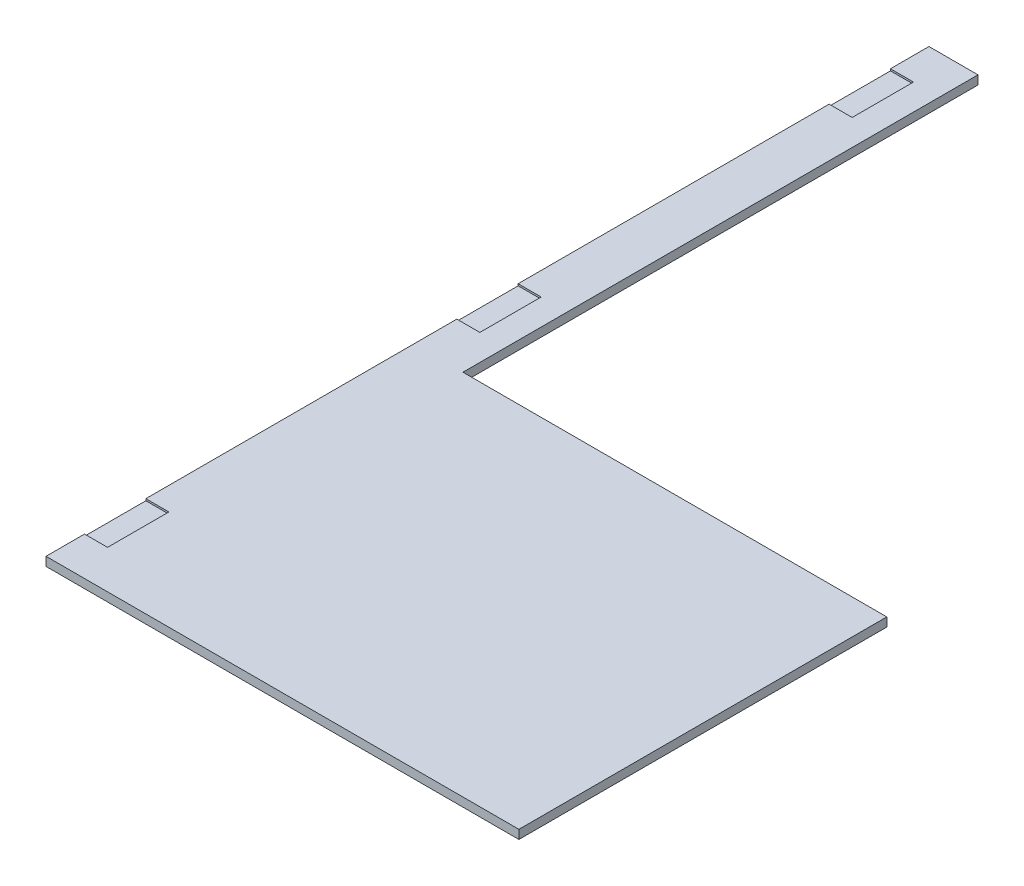
ISO-10303-21;
HEADER;
FILE_DESCRIPTION(('STEP AP214'),'2;1');
FILE_NAME('part.step','',(''),(''),'','','');
FILE_SCHEMA(('AUTOMOTIVE_DESIGN { 1 0 10303 214 1 1 1 1 }'));
ENDSEC;
DATA;
#1=APPLICATION_CONTEXT('core data for automotive mechanical design processes');
#2=APPLICATION_PROTOCOL_DEFINITION('international standard','automotive_design',2000,#1);
#3=PRODUCT_CONTEXT('',#1,'mechanical');
#4=PRODUCT('Part','Part','',(#3));
#5=PRODUCT_RELATED_PRODUCT_CATEGORY('part','',(#4));
#6=PRODUCT_DEFINITION_FORMATION('','',#4);
#7=PRODUCT_DEFINITION_CONTEXT('part definition',#1,'design');
#8=PRODUCT_DEFINITION('design','',#6,#7);
#9=PRODUCT_DEFINITION_SHAPE('','',#8);
#10=(LENGTH_UNIT() NAMED_UNIT(*) SI_UNIT(.MILLI.,.METRE.));
#11=(NAMED_UNIT(*) PLANE_ANGLE_UNIT() SI_UNIT($,.RADIAN.));
#12=(NAMED_UNIT(*) SI_UNIT($,.STERADIAN.) SOLID_ANGLE_UNIT());
#13=UNCERTAINTY_MEASURE_WITH_UNIT(LENGTH_MEASURE(1.E-05),#10,'distance_accuracy_value','');
#14=(GEOMETRIC_REPRESENTATION_CONTEXT(3) GLOBAL_UNCERTAINTY_ASSIGNED_CONTEXT((#13)) GLOBAL_UNIT_ASSIGNED_CONTEXT((#10,
#11,#12)) REPRESENTATION_CONTEXT('',''));
#15=CARTESIAN_POINT('',(0.,0.,0.));
#16=DIRECTION('',(0.,0.,1.));
#17=DIRECTION('',(1.,0.,0.));
#18=AXIS2_PLACEMENT_3D('',#15,#16,#17);
#19=CARTESIAN_POINT('',(489.74375,18.25625,-381.));
#20=DIRECTION('',(0.,0.,1.));
#21=DIRECTION('',(1.,0.,0.));
#22=AXIS2_PLACEMENT_3D('',#19,#20,#21);
#23=PLANE('',#22);
#24=DIRECTION('',(-1.,0.,0.));
#25=VECTOR('',#24,1.);
#26=CARTESIAN_POINT('',(489.74375,0.,-381.));
#27=LINE('',#26,#25);
#28=CARTESIAN_POINT('',(489.74375,0.,-381.));
#29=VERTEX_POINT('',#28);
#30=CARTESIAN_POINT('',(-388.14375,0.,-381.));
#31=VERTEX_POINT('',#30);
#32=EDGE_CURVE('E302',#29,#31,#27,.T.);
#33=ORIENTED_EDGE('',*,*,#32,.T.);
#34=DIRECTION('',(0.,-1.,0.));
#35=VECTOR('',#34,1.);
#36=CARTESIAN_POINT('',(-388.14375,18.25625,-381.));
#37=LINE('',#36,#35);
#38=CARTESIAN_POINT('',(-388.14375,18.25625,-381.));
#39=VERTEX_POINT('',#38);
#40=EDGE_CURVE('E11',#39,#31,#37,.T.);
#41=ORIENTED_EDGE('',*,*,#40,.F.);
#42=DIRECTION('',(-1.,0.,0.));
#43=VECTOR('',#42,1.);
#44=CARTESIAN_POINT('',(489.74375,18.25625,-381.));
#45=LINE('',#44,#43);
#46=CARTESIAN_POINT('',(489.74375,18.25625,-381.));
#47=VERTEX_POINT('',#46);
#48=EDGE_CURVE('E279',#47,#39,#45,.T.);
#49=ORIENTED_EDGE('',*,*,#48,.F.);
#50=DIRECTION('',(0.,-1.,0.));
#51=VECTOR('',#50,1.);
#52=CARTESIAN_POINT('',(489.74375,18.25625,-381.));
#53=LINE('',#52,#51);
#54=EDGE_CURVE('E301',#47,#29,#53,.T.);
#55=ORIENTED_EDGE('',*,*,#54,.T.);
#56=EDGE_LOOP('',(#33,#41,#49,#55));
#57=FACE_BOUND('',#56,.T.);
#58=ADVANCED_FACE('F38',(#57),#23,.F.);
#59=CARTESIAN_POINT('',(-388.14375,18.25625,-1447.8));
#60=DIRECTION('',(-1.,0.,0.));
#61=DIRECTION('',(0.,0.,1.));
#62=AXIS2_PLACEMENT_3D('',#59,#60,#61);
#63=PLANE('',#62);
#64=DIRECTION('',(0.,0.,-1.));
#65=VECTOR('',#64,1.);
#66=CARTESIAN_POINT('',(-388.14375,0.,-1447.8));
#67=LINE('',#66,#65);
#68=CARTESIAN_POINT('',(-388.14375,0.,-1447.8));
#69=VERTEX_POINT('',#68);
#70=EDGE_CURVE('E306',#31,#69,#67,.T.);
#71=ORIENTED_EDGE('',*,*,#70,.T.);
#72=DIRECTION('',(0.,-1.,0.));
#73=VECTOR('',#72,1.);
#74=CARTESIAN_POINT('',(-388.14375,18.25625,-1447.8));
#75=LINE('',#74,#73);
#76=CARTESIAN_POINT('',(-388.14375,18.25625,-1447.8));
#77=VERTEX_POINT('',#76);
#78=EDGE_CURVE('E46',#77,#69,#75,.T.);
#79=ORIENTED_EDGE('',*,*,#78,.F.);
#80=DIRECTION('',(0.,0.,-1.));
#81=VECTOR('',#80,1.);
#82=CARTESIAN_POINT('',(-388.14375,18.25625,-1447.8));
#83=LINE('',#82,#81);
#84=EDGE_CURVE('E283',#39,#77,#83,.T.);
#85=ORIENTED_EDGE('',*,*,#84,.F.);
#86=ORIENTED_EDGE('',*,*,#40,.T.);
#87=EDGE_LOOP('',(#71,#79,#85,#86));
#88=FACE_BOUND('',#87,.T.);
#89=ADVANCED_FACE('F391',(#88),#63,.F.);
#90=CARTESIAN_POINT('',(-489.74375,18.25625,-1447.8));
#91=DIRECTION('',(0.,0.,1.));
#92=DIRECTION('',(1.,0.,0.));
#93=AXIS2_PLACEMENT_3D('',#90,#91,#92);
#94=PLANE('',#93);
#95=DIRECTION('',(-1.,0.,0.));
#96=VECTOR('',#95,1.);
#97=CARTESIAN_POINT('',(-489.74375,0.,-1447.8));
#98=LINE('',#97,#96);
#99=CARTESIAN_POINT('',(-489.74375,0.,-1447.8));
#100=VERTEX_POINT('',#99);
#101=EDGE_CURVE('E310',#69,#100,#98,.T.);
#102=ORIENTED_EDGE('',*,*,#101,.T.);
#103=DIRECTION('',(0.,-1.,0.));
#104=VECTOR('',#103,1.);
#105=CARTESIAN_POINT('',(-489.74375,18.25625,-1447.8));
#106=LINE('',#105,#104);
#107=CARTESIAN_POINT('',(-489.74375,18.25625,-1447.8));
#108=VERTEX_POINT('',#107);
#109=EDGE_CURVE('E333',#108,#100,#106,.T.);
#110=ORIENTED_EDGE('',*,*,#109,.F.);
#111=DIRECTION('',(-1.,0.,0.));
#112=VECTOR('',#111,1.);
#113=CARTESIAN_POINT('',(-489.74375,18.25625,-1447.8));
#114=LINE('',#113,#112);
#115=EDGE_CURVE('E287',#77,#108,#114,.T.);
#116=ORIENTED_EDGE('',*,*,#115,.F.);
#117=ORIENTED_EDGE('',*,*,#78,.T.);
#118=EDGE_LOOP('',(#102,#110,#116,#117));
#119=FACE_BOUND('',#118,.T.);
#120=ADVANCED_FACE('F342',(#119),#94,.F.);
#121=CARTESIAN_POINT('',(-489.74375,18.25625,381.));
#122=DIRECTION('',(1.,0.,0.));
#123=DIRECTION('',(0.,0.,-1.));
#124=AXIS2_PLACEMENT_3D('',#121,#122,#123);
#125=PLANE('',#124);
#126=DIRECTION('',(0.,0.,1.));
#127=VECTOR('',#126,1.);
#128=CARTESIAN_POINT('',(-489.74375,14.44625,-1368.02719145695));
#129=LINE('',#128,#127);
#130=CARTESIAN_POINT('',(-489.74375,14.44625,-1368.02719145695));
#131=VERTEX_POINT('',#130);
#132=CARTESIAN_POINT('',(-489.74375,14.44625,-1241.02719145695));
#133=VERTEX_POINT('',#132);
#134=EDGE_CURVE('E177',#131,#133,#129,.T.);
#135=ORIENTED_EDGE('',*,*,#134,.F.);
#136=DIRECTION('',(0.,1.,0.));
#137=VECTOR('',#136,1.);
#138=CARTESIAN_POINT('',(-489.74375,14.44625,-1368.02719145695));
#139=LINE('',#138,#137);
#140=CARTESIAN_POINT('',(-489.74375,18.25625,-1368.02719145695));
#141=VERTEX_POINT('',#140);
#142=EDGE_CURVE('E307',#131,#141,#139,.T.);
#143=ORIENTED_EDGE('',*,*,#142,.T.);
#144=DIRECTION('',(0.,0.,1.));
#145=VECTOR('',#144,1.);
#146=CARTESIAN_POINT('',(-489.74375,18.25625,-381.));
#147=LINE('',#146,#145);
#148=EDGE_CURVE('E291',#108,#141,#147,.T.);
#149=ORIENTED_EDGE('',*,*,#148,.F.);
#150=ORIENTED_EDGE('',*,*,#109,.T.);
#151=DIRECTION('',(0.,0.,1.));
#152=VECTOR('',#151,1.);
#153=CARTESIAN_POINT('',(-489.74375,0.,381.));
#154=LINE('',#153,#152);
#155=CARTESIAN_POINT('',(-489.74375,0.,381.));
#156=VERTEX_POINT('',#155);
#157=EDGE_CURVE('E314',#100,#156,#154,.T.);
#158=ORIENTED_EDGE('',*,*,#157,.T.);
#159=DIRECTION('',(0.,-1.,0.));
#160=VECTOR('',#159,1.);
#161=CARTESIAN_POINT('',(-489.74375,18.25625,381.));
#162=LINE('',#161,#160);
#163=CARTESIAN_POINT('',(-489.74375,18.25625,381.));
#164=VERTEX_POINT('',#163);
#165=EDGE_CURVE('E329',#164,#156,#162,.T.);
#166=ORIENTED_EDGE('',*,*,#165,.F.);
#167=CARTESIAN_POINT('',(-489.74375,18.25625,301.227191456949));
#168=VERTEX_POINT('',#167);
#169=EDGE_CURVE('E290',#168,#164,#147,.T.);
#170=ORIENTED_EDGE('',*,*,#169,.F.);
#171=DIRECTION('',(0.,1.,0.));
#172=VECTOR('',#171,1.);
#173=CARTESIAN_POINT('',(-489.743750000016,14.44625,301.227191456949));
#174=LINE('',#173,#172);
#175=CARTESIAN_POINT('',(-489.743750000016,14.44625,301.227191456949));
#176=VERTEX_POINT('',#175);
#177=EDGE_CURVE('E53',#176,#168,#174,.T.);
#178=ORIENTED_EDGE('',*,*,#177,.F.);
#179=DIRECTION('',(0.,0.,1.));
#180=VECTOR('',#179,1.);
#181=CARTESIAN_POINT('',(-489.743750000016,14.44625,174.227191456949));
#182=LINE('',#181,#180);
#183=CARTESIAN_POINT('',(-489.743750000016,14.44625,174.227191456949));
#184=VERTEX_POINT('',#183);
#185=EDGE_CURVE('E246',#184,#176,#182,.T.);
#186=ORIENTED_EDGE('',*,*,#185,.F.);
#187=DIRECTION('',(0.,1.,0.));
#188=VECTOR('',#187,1.);
#189=CARTESIAN_POINT('',(-489.743750000016,14.44625,174.227191456949));
#190=LINE('',#189,#188);
#191=CARTESIAN_POINT('',(-489.743750000016,18.25625,174.227191456949));
#192=VERTEX_POINT('',#191);
#193=EDGE_CURVE('E259',#184,#192,#190,.T.);
#194=ORIENTED_EDGE('',*,*,#193,.T.);
#195=CARTESIAN_POINT('',(-489.74375,18.25625,-469.9));
#196=VERTEX_POINT('',#195);
#197=EDGE_CURVE('E364',#196,#192,#147,.T.);
#198=ORIENTED_EDGE('',*,*,#197,.F.);
#199=DIRECTION('',(0.,1.,0.));
#200=VECTOR('',#199,1.);
#201=CARTESIAN_POINT('',(-489.743749999992,14.44625,-469.9));
#202=LINE('',#201,#200);
#203=CARTESIAN_POINT('',(-489.743749999992,14.44625,-469.9));
#204=VERTEX_POINT('',#203);
#205=EDGE_CURVE('E61',#204,#196,#202,.T.);
#206=ORIENTED_EDGE('',*,*,#205,.F.);
#207=DIRECTION('',(0.,0.,1.));
#208=VECTOR('',#207,1.);
#209=CARTESIAN_POINT('',(-489.743749999992,14.44625,-596.9));
#210=LINE('',#209,#208);
#211=CARTESIAN_POINT('',(-489.743749999992,14.44625,-596.9));
#212=VERTEX_POINT('',#211);
#213=EDGE_CURVE('E207',#212,#204,#210,.T.);
#214=ORIENTED_EDGE('',*,*,#213,.F.);
#215=DIRECTION('',(0.,1.,0.));
#216=VECTOR('',#215,1.);
#217=CARTESIAN_POINT('',(-489.743749999992,14.44625,-596.9));
#218=LINE('',#217,#216);
#219=CARTESIAN_POINT('',(-489.743749999992,18.25625,-596.9));
#220=VERTEX_POINT('',#219);
#221=EDGE_CURVE('E220',#212,#220,#218,.T.);
#222=ORIENTED_EDGE('',*,*,#221,.T.);
#223=CARTESIAN_POINT('',(-489.74375,18.25625,-1241.02719145695));
#224=VERTEX_POINT('',#223);
#225=EDGE_CURVE('E193',#224,#220,#147,.T.);
#226=ORIENTED_EDGE('',*,*,#225,.F.);
#227=DIRECTION('',(0.,1.,0.));
#228=VECTOR('',#227,1.);
#229=CARTESIAN_POINT('',(-489.74375,14.44625,-1241.02719145695));
#230=LINE('',#229,#228);
#231=EDGE_CURVE('E169',#133,#224,#230,.T.);
#232=ORIENTED_EDGE('',*,*,#231,.F.);
#233=EDGE_LOOP('',(#135,#143,#149,#150,#158,#166,#170,#178,#186,#194,#198,#206,#214,#222,#226,#232));
#234=FACE_BOUND('',#233,.T.);
#235=ADVANCED_FACE('F190',(#234),#125,.F.);
#236=CARTESIAN_POINT('',(-489.74375,18.25625,381.));
#237=DIRECTION('',(0.,0.,-1.));
#238=DIRECTION('',(-1.,0.,0.));
#239=AXIS2_PLACEMENT_3D('',#236,#237,#238);
#240=PLANE('',#239);
#241=DIRECTION('',(1.,0.,0.));
#242=VECTOR('',#241,1.);
#243=CARTESIAN_POINT('',(-489.74375,0.,381.));
#244=LINE('',#243,#242);
#245=CARTESIAN_POINT('',(489.74375,0.,381.));
#246=VERTEX_POINT('',#245);
#247=EDGE_CURVE('E317',#156,#246,#244,.T.);
#248=ORIENTED_EDGE('',*,*,#247,.T.);
#249=DIRECTION('',(0.,-1.,0.));
#250=VECTOR('',#249,1.);
#251=CARTESIAN_POINT('',(489.74375,18.25625,381.));
#252=LINE('',#251,#250);
#253=CARTESIAN_POINT('',(489.74375,18.25625,381.));
#254=VERTEX_POINT('',#253);
#255=EDGE_CURVE('E325',#254,#246,#252,.T.);
#256=ORIENTED_EDGE('',*,*,#255,.F.);
#257=DIRECTION('',(1.,0.,0.));
#258=VECTOR('',#257,1.);
#259=CARTESIAN_POINT('',(-489.74375,18.25625,381.));
#260=LINE('',#259,#258);
#261=EDGE_CURVE('E295',#164,#254,#260,.T.);
#262=ORIENTED_EDGE('',*,*,#261,.F.);
#263=ORIENTED_EDGE('',*,*,#165,.T.);
#264=EDGE_LOOP('',(#248,#256,#262,#263));
#265=FACE_BOUND('',#264,.T.);
#266=ADVANCED_FACE('F355',(#265),#240,.F.);
#267=CARTESIAN_POINT('',(489.74375,18.25625,381.));
#268=DIRECTION('',(-1.,0.,0.));
#269=DIRECTION('',(0.,0.,1.));
#270=AXIS2_PLACEMENT_3D('',#267,#268,#269);
#271=PLANE('',#270);
#272=DIRECTION('',(0.,0.,-1.));
#273=VECTOR('',#272,1.);
#274=CARTESIAN_POINT('',(489.74375,0.,381.));
#275=LINE('',#274,#273);
#276=EDGE_CURVE('E284',#246,#29,#275,.T.);
#277=ORIENTED_EDGE('',*,*,#276,.T.);
#278=ORIENTED_EDGE('',*,*,#54,.F.);
#279=DIRECTION('',(0.,0.,-1.));
#280=VECTOR('',#279,1.);
#281=CARTESIAN_POINT('',(489.74375,18.25625,381.));
#282=LINE('',#281,#280);
#283=EDGE_CURVE('E298',#254,#47,#282,.T.);
#284=ORIENTED_EDGE('',*,*,#283,.F.);
#285=ORIENTED_EDGE('',*,*,#255,.T.);
#286=EDGE_LOOP('',(#277,#278,#284,#285));
#287=FACE_BOUND('',#286,.T.);
#288=ADVANCED_FACE('F394',(#287),#271,.F.);
#289=CARTESIAN_POINT('',(0.,18.25625,0.));
#290=DIRECTION('',(0.,1.,0.));
#291=DIRECTION('',(0.,0.,1.));
#292=AXIS2_PLACEMENT_3D('',#289,#290,#291);
#293=PLANE('',#292);
#294=DIRECTION('',(-1.,0.,0.));
#295=VECTOR('',#294,1.);
#296=CARTESIAN_POINT('',(-489.74375,18.25625,-1368.02719145695));
#297=LINE('',#296,#295);
#298=CARTESIAN_POINT('',(-441.99175,18.25625,-1368.02719145695));
#299=VERTEX_POINT('',#298);
#300=EDGE_CURVE('E187',#299,#141,#297,.T.);
#301=ORIENTED_EDGE('',*,*,#300,.F.);
#302=DIRECTION('',(0.,0.,-1.));
#303=VECTOR('',#302,1.);
#304=CARTESIAN_POINT('',(-441.99175,18.25625,-1368.02719145695));
#305=LINE('',#304,#303);
#306=CARTESIAN_POINT('',(-441.99175,18.25625,-1241.02719145695));
#307=VERTEX_POINT('',#306);
#308=EDGE_CURVE('E374',#307,#299,#305,.T.);
#309=ORIENTED_EDGE('',*,*,#308,.F.);
#310=DIRECTION('',(1.,0.,0.));
#311=VECTOR('',#310,1.);
#312=CARTESIAN_POINT('',(-441.99175,18.25625,-1241.02719145695));
#313=LINE('',#312,#311);
#314=EDGE_CURVE('E234',#224,#307,#313,.T.);
#315=ORIENTED_EDGE('',*,*,#314,.F.);
#316=ORIENTED_EDGE('',*,*,#225,.T.);
#317=DIRECTION('',(-1.,0.,0.));
#318=VECTOR('',#317,1.);
#319=CARTESIAN_POINT('',(-489.743749999992,18.25625,-596.9));
#320=LINE('',#319,#318);
#321=CARTESIAN_POINT('',(-441.991749999992,18.25625,-596.9));
#322=VERTEX_POINT('',#321);
#323=EDGE_CURVE('E221',#322,#220,#320,.T.);
#324=ORIENTED_EDGE('',*,*,#323,.F.);
#325=DIRECTION('',(0.,0.,-1.));
#326=VECTOR('',#325,1.);
#327=CARTESIAN_POINT('',(-441.991749999992,18.25625,-596.9));
#328=LINE('',#327,#326);
#329=CARTESIAN_POINT('',(-441.991749999992,18.25625,-469.9));
#330=VERTEX_POINT('',#329);
#331=EDGE_CURVE('E208',#330,#322,#328,.T.);
#332=ORIENTED_EDGE('',*,*,#331,.F.);
#333=DIRECTION('',(1.,0.,0.));
#334=VECTOR('',#333,1.);
#335=CARTESIAN_POINT('',(-441.991749999992,18.25625,-469.9));
#336=LINE('',#335,#334);
#337=EDGE_CURVE('E224',#196,#330,#336,.T.);
#338=ORIENTED_EDGE('',*,*,#337,.F.);
#339=ORIENTED_EDGE('',*,*,#197,.T.);
#340=DIRECTION('',(-1.,0.,0.));
#341=VECTOR('',#340,1.);
#342=CARTESIAN_POINT('',(-489.743750000016,18.25625,174.227191456949));
#343=LINE('',#342,#341);
#344=CARTESIAN_POINT('',(-441.991749999984,18.25625,174.227191456949));
#345=VERTEX_POINT('',#344);
#346=EDGE_CURVE('E260',#345,#192,#343,.T.);
#347=ORIENTED_EDGE('',*,*,#346,.F.);
#348=DIRECTION('',(0.,0.,-1.));
#349=VECTOR('',#348,1.);
#350=CARTESIAN_POINT('',(-441.991749999984,18.25625,174.227191456949));
#351=LINE('',#350,#349);
#352=CARTESIAN_POINT('',(-441.991749999984,18.25625,301.227191456949));
#353=VERTEX_POINT('',#352);
#354=EDGE_CURVE('E247',#353,#345,#351,.T.);
#355=ORIENTED_EDGE('',*,*,#354,.F.);
#356=DIRECTION('',(1.,0.,0.));
#357=VECTOR('',#356,1.);
#358=CARTESIAN_POINT('',(-441.991749999984,18.25625,301.227191456949));
#359=LINE('',#358,#357);
#360=EDGE_CURVE('E263',#168,#353,#359,.T.);
#361=ORIENTED_EDGE('',*,*,#360,.F.);
#362=ORIENTED_EDGE('',*,*,#169,.T.);
#363=ORIENTED_EDGE('',*,*,#261,.T.);
#364=ORIENTED_EDGE('',*,*,#283,.T.);
#365=ORIENTED_EDGE('',*,*,#48,.T.);
#366=ORIENTED_EDGE('',*,*,#84,.T.);
#367=ORIENTED_EDGE('',*,*,#115,.T.);
#368=ORIENTED_EDGE('',*,*,#148,.T.);
#369=EDGE_LOOP('',(#301,#309,#315,#316,#324,#332,#338,#339,#347,#355,#361,#362,#363,#364,#365,
#366,#367,#368));
#370=FACE_BOUND('',#369,.T.);
#371=ADVANCED_FACE('F360',(#370),#293,.T.);
#372=CARTESIAN_POINT('',(0.,0.,0.));
#373=DIRECTION('',(0.,1.,0.));
#374=DIRECTION('',(0.,0.,1.));
#375=AXIS2_PLACEMENT_3D('',#372,#373,#374);
#376=PLANE('',#375);
#377=ORIENTED_EDGE('',*,*,#32,.F.);
#378=ORIENTED_EDGE('',*,*,#276,.F.);
#379=ORIENTED_EDGE('',*,*,#247,.F.);
#380=ORIENTED_EDGE('',*,*,#157,.F.);
#381=ORIENTED_EDGE('',*,*,#101,.F.);
#382=ORIENTED_EDGE('',*,*,#70,.F.);
#383=EDGE_LOOP('',(#377,#378,#379,#380,#381,#382));
#384=FACE_BOUND('',#383,.T.);
#385=ADVANCED_FACE('F347',(#384),#376,.F.);
#386=CARTESIAN_POINT('',(-489.743750000016,14.44625,174.227191456949));
#387=DIRECTION('',(0.,0.,-1.));
#388=DIRECTION('',(-1.,0.,0.));
#389=AXIS2_PLACEMENT_3D('',#386,#387,#388);
#390=PLANE('',#389);
#391=ORIENTED_EDGE('',*,*,#346,.T.);
#392=ORIENTED_EDGE('',*,*,#193,.F.);
#393=DIRECTION('',(-1.,0.,0.));
#394=VECTOR('',#393,1.);
#395=CARTESIAN_POINT('',(-489.743750000016,14.44625,174.227191456949));
#396=LINE('',#395,#394);
#397=CARTESIAN_POINT('',(-441.991749999984,14.44625,174.227191456949));
#398=VERTEX_POINT('',#397);
#399=EDGE_CURVE('E242',#398,#184,#396,.T.);
#400=ORIENTED_EDGE('',*,*,#399,.F.);
#401=DIRECTION('',(0.,1.,0.));
#402=VECTOR('',#401,1.);
#403=CARTESIAN_POINT('',(-441.991749999984,14.44625,174.227191456949));
#404=LINE('',#403,#402);
#405=EDGE_CURVE('E225',#398,#345,#404,.T.);
#406=ORIENTED_EDGE('',*,*,#405,.T.);
#407=EDGE_LOOP('',(#391,#392,#400,#406));
#408=FACE_BOUND('',#407,.T.);
#409=ADVANCED_FACE('F427',(#408),#390,.F.);
#410=CARTESIAN_POINT('',(-441.991749999984,14.44625,174.227191456949));
#411=DIRECTION('',(1.,0.,0.));
#412=DIRECTION('',(0.,0.,-1.));
#413=AXIS2_PLACEMENT_3D('',#410,#411,#412);
#414=PLANE('',#413);
#415=ORIENTED_EDGE('',*,*,#354,.T.);
#416=ORIENTED_EDGE('',*,*,#405,.F.);
#417=DIRECTION('',(0.,0.,-1.));
#418=VECTOR('',#417,1.);
#419=CARTESIAN_POINT('',(-441.991749999984,14.44625,174.227191456949));
#420=LINE('',#419,#418);
#421=CARTESIAN_POINT('',(-441.991749999984,14.44625,301.227191456949));
#422=VERTEX_POINT('',#421);
#423=EDGE_CURVE('E255',#422,#398,#420,.T.);
#424=ORIENTED_EDGE('',*,*,#423,.F.);
#425=DIRECTION('',(0.,1.,0.));
#426=VECTOR('',#425,1.);
#427=CARTESIAN_POINT('',(-441.991749999984,14.44625,301.227191456949));
#428=LINE('',#427,#426);
#429=EDGE_CURVE('E271',#422,#353,#428,.T.);
#430=ORIENTED_EDGE('',*,*,#429,.T.);
#431=EDGE_LOOP('',(#415,#416,#424,#430));
#432=FACE_BOUND('',#431,.T.);
#433=ADVANCED_FACE('F432',(#432),#414,.F.);
#434=CARTESIAN_POINT('',(-441.991749999984,14.44625,301.227191456949));
#435=DIRECTION('',(0.,0.,1.));
#436=DIRECTION('',(1.,0.,0.));
#437=AXIS2_PLACEMENT_3D('',#434,#435,#436);
#438=PLANE('',#437);
#439=ORIENTED_EDGE('',*,*,#360,.T.);
#440=ORIENTED_EDGE('',*,*,#429,.F.);
#441=DIRECTION('',(1.,0.,0.));
#442=VECTOR('',#441,1.);
#443=CARTESIAN_POINT('',(-441.991749999984,14.44625,301.227191456949));
#444=LINE('',#443,#442);
#445=EDGE_CURVE('E251',#176,#422,#444,.T.);
#446=ORIENTED_EDGE('',*,*,#445,.F.);
#447=ORIENTED_EDGE('',*,*,#177,.T.);
#448=EDGE_LOOP('',(#439,#440,#446,#447));
#449=FACE_BOUND('',#448,.T.);
#450=ADVANCED_FACE('F442',(#449),#438,.F.);
#451=CARTESIAN_POINT('',(0.,14.44625,0.));
#452=DIRECTION('',(0.,-1.,0.));
#453=DIRECTION('',(0.,0.,-1.));
#454=AXIS2_PLACEMENT_3D('',#451,#452,#453);
#455=PLANE('',#454);
#456=ORIENTED_EDGE('',*,*,#399,.T.);
#457=ORIENTED_EDGE('',*,*,#185,.T.);
#458=ORIENTED_EDGE('',*,*,#445,.T.);
#459=ORIENTED_EDGE('',*,*,#423,.T.);
#460=EDGE_LOOP('',(#456,#457,#458,#459));
#461=FACE_BOUND('',#460,.T.);
#462=ADVANCED_FACE('F452',(#461),#455,.F.);
#463=CARTESIAN_POINT('',(-489.743749999992,14.44625,-596.9));
#464=DIRECTION('',(0.,0.,-1.));
#465=DIRECTION('',(-1.,0.,0.));
#466=AXIS2_PLACEMENT_3D('',#463,#464,#465);
#467=PLANE('',#466);
#468=ORIENTED_EDGE('',*,*,#323,.T.);
#469=ORIENTED_EDGE('',*,*,#221,.F.);
#470=DIRECTION('',(-1.,0.,0.));
#471=VECTOR('',#470,1.);
#472=CARTESIAN_POINT('',(-489.743749999992,14.44625,-596.9));
#473=LINE('',#472,#471);
#474=CARTESIAN_POINT('',(-441.991749999992,14.44625,-596.9));
#475=VERTEX_POINT('',#474);
#476=EDGE_CURVE('E203',#475,#212,#473,.T.);
#477=ORIENTED_EDGE('',*,*,#476,.F.);
#478=DIRECTION('',(0.,1.,0.));
#479=VECTOR('',#478,1.);
#480=CARTESIAN_POINT('',(-441.991749999992,14.44625,-596.9));
#481=LINE('',#480,#479);
#482=EDGE_CURVE('E231',#475,#322,#481,.T.);
#483=ORIENTED_EDGE('',*,*,#482,.T.);
#484=EDGE_LOOP('',(#468,#469,#477,#483));
#485=FACE_BOUND('',#484,.T.);
#486=ADVANCED_FACE('F461',(#485),#467,.F.);
#487=CARTESIAN_POINT('',(-441.991749999992,14.44625,-596.9));
#488=DIRECTION('',(1.,0.,0.));
#489=DIRECTION('',(0.,0.,-1.));
#490=AXIS2_PLACEMENT_3D('',#487,#488,#489);
#491=PLANE('',#490);
#492=ORIENTED_EDGE('',*,*,#331,.T.);
#493=ORIENTED_EDGE('',*,*,#482,.F.);
#494=DIRECTION('',(0.,0.,-1.));
#495=VECTOR('',#494,1.);
#496=CARTESIAN_POINT('',(-441.991749999992,14.44625,-596.9));
#497=LINE('',#496,#495);
#498=CARTESIAN_POINT('',(-441.991749999992,14.44625,-469.9));
#499=VERTEX_POINT('',#498);
#500=EDGE_CURVE('E216',#499,#475,#497,.T.);
#501=ORIENTED_EDGE('',*,*,#500,.F.);
#502=DIRECTION('',(0.,1.,0.));
#503=VECTOR('',#502,1.);
#504=CARTESIAN_POINT('',(-441.991749999992,14.44625,-469.9));
#505=LINE('',#504,#503);
#506=EDGE_CURVE('E235',#499,#330,#505,.T.);
#507=ORIENTED_EDGE('',*,*,#506,.T.);
#508=EDGE_LOOP('',(#492,#493,#501,#507));
#509=FACE_BOUND('',#508,.T.);
#510=ADVANCED_FACE('F471',(#509),#491,.F.);
#511=CARTESIAN_POINT('',(-441.991749999992,14.44625,-469.9));
#512=DIRECTION('',(0.,0.,1.));
#513=DIRECTION('',(1.,0.,0.));
#514=AXIS2_PLACEMENT_3D('',#511,#512,#513);
#515=PLANE('',#514);
#516=ORIENTED_EDGE('',*,*,#337,.T.);
#517=ORIENTED_EDGE('',*,*,#506,.F.);
#518=DIRECTION('',(1.,0.,0.));
#519=VECTOR('',#518,1.);
#520=CARTESIAN_POINT('',(-441.991749999992,14.44625,-469.9));
#521=LINE('',#520,#519);
#522=EDGE_CURVE('E212',#204,#499,#521,.T.);
#523=ORIENTED_EDGE('',*,*,#522,.F.);
#524=ORIENTED_EDGE('',*,*,#205,.T.);
#525=EDGE_LOOP('',(#516,#517,#523,#524));
#526=FACE_BOUND('',#525,.T.);
#527=ADVANCED_FACE('F481',(#526),#515,.F.);
#528=CARTESIAN_POINT('',(0.,14.44625,0.));
#529=DIRECTION('',(0.,-1.,0.));
#530=DIRECTION('',(0.,0.,-1.));
#531=AXIS2_PLACEMENT_3D('',#528,#529,#530);
#532=PLANE('',#531);
#533=ORIENTED_EDGE('',*,*,#476,.T.);
#534=ORIENTED_EDGE('',*,*,#213,.T.);
#535=ORIENTED_EDGE('',*,*,#522,.T.);
#536=ORIENTED_EDGE('',*,*,#500,.T.);
#537=EDGE_LOOP('',(#533,#534,#535,#536));
#538=FACE_BOUND('',#537,.T.);
#539=ADVANCED_FACE('F491',(#538),#532,.F.);
#540=CARTESIAN_POINT('',(-489.74375,14.44625,-1368.02719145695));
#541=DIRECTION('',(0.,0.,-1.));
#542=DIRECTION('',(-1.,0.,0.));
#543=AXIS2_PLACEMENT_3D('',#540,#541,#542);
#544=PLANE('',#543);
#545=ORIENTED_EDGE('',*,*,#300,.T.);
#546=ORIENTED_EDGE('',*,*,#142,.F.);
#547=DIRECTION('',(-1.,0.,0.));
#548=VECTOR('',#547,1.);
#549=CARTESIAN_POINT('',(-489.74375,14.44625,-1368.02719145695));
#550=LINE('',#549,#548);
#551=CARTESIAN_POINT('',(-441.99175,14.44625,-1368.02719145695));
#552=VERTEX_POINT('',#551);
#553=EDGE_CURVE('E183',#552,#131,#550,.T.);
#554=ORIENTED_EDGE('',*,*,#553,.F.);
#555=DIRECTION('',(0.,1.,0.));
#556=VECTOR('',#555,1.);
#557=CARTESIAN_POINT('',(-441.99175,14.44625,-1368.02719145695));
#558=LINE('',#557,#556);
#559=EDGE_CURVE('E198',#552,#299,#558,.T.);
#560=ORIENTED_EDGE('',*,*,#559,.T.);
#561=EDGE_LOOP('',(#545,#546,#554,#560));
#562=FACE_BOUND('',#561,.T.);
#563=ADVANCED_FACE('F386',(#562),#544,.F.);
#564=CARTESIAN_POINT('',(-441.99175,14.44625,-1368.02719145695));
#565=DIRECTION('',(1.,0.,0.));
#566=DIRECTION('',(0.,0.,-1.));
#567=AXIS2_PLACEMENT_3D('',#564,#565,#566);
#568=PLANE('',#567);
#569=ORIENTED_EDGE('',*,*,#308,.T.);
#570=ORIENTED_EDGE('',*,*,#559,.F.);
#571=DIRECTION('',(0.,0.,-1.));
#572=VECTOR('',#571,1.);
#573=CARTESIAN_POINT('',(-441.99175,14.44625,-1368.02719145695));
#574=LINE('',#573,#572);
#575=CARTESIAN_POINT('',(-441.99175,14.44625,-1241.02719145695));
#576=VERTEX_POINT('',#575);
#577=EDGE_CURVE('E176',#576,#552,#574,.T.);
#578=ORIENTED_EDGE('',*,*,#577,.F.);
#579=DIRECTION('',(0.,1.,0.));
#580=VECTOR('',#579,1.);
#581=CARTESIAN_POINT('',(-441.99175,14.44625,-1241.02719145695));
#582=LINE('',#581,#580);
#583=EDGE_CURVE('E171',#576,#307,#582,.T.);
#584=ORIENTED_EDGE('',*,*,#583,.T.);
#585=EDGE_LOOP('',(#569,#570,#578,#584));
#586=FACE_BOUND('',#585,.T.);
#587=ADVANCED_FACE('F388',(#586),#568,.F.);
#588=CARTESIAN_POINT('',(-441.99175,14.44625,-1241.02719145695));
#589=DIRECTION('',(0.,0.,1.));
#590=DIRECTION('',(1.,0.,0.));
#591=AXIS2_PLACEMENT_3D('',#588,#589,#590);
#592=PLANE('',#591);
#593=ORIENTED_EDGE('',*,*,#314,.T.);
#594=ORIENTED_EDGE('',*,*,#583,.F.);
#595=DIRECTION('',(1.,0.,0.));
#596=VECTOR('',#595,1.);
#597=CARTESIAN_POINT('',(-441.99175,14.44625,-1241.02719145695));
#598=LINE('',#597,#596);
#599=EDGE_CURVE('E164',#133,#576,#598,.T.);
#600=ORIENTED_EDGE('',*,*,#599,.F.);
#601=ORIENTED_EDGE('',*,*,#231,.T.);
#602=EDGE_LOOP('',(#593,#594,#600,#601));
#603=FACE_BOUND('',#602,.T.);
#604=ADVANCED_FACE('F167',(#603),#592,.F.);
#605=CARTESIAN_POINT('',(0.,14.44625,0.));
#606=DIRECTION('',(0.,-1.,0.));
#607=DIRECTION('',(0.,0.,-1.));
#608=AXIS2_PLACEMENT_3D('',#605,#606,#607);
#609=PLANE('',#608);
#610=ORIENTED_EDGE('',*,*,#134,.T.);
#611=ORIENTED_EDGE('',*,*,#599,.T.);
#612=ORIENTED_EDGE('',*,*,#577,.T.);
#613=ORIENTED_EDGE('',*,*,#553,.T.);
#614=EDGE_LOOP('',(#610,#611,#612,#613));
#615=FACE_BOUND('',#614,.T.);
#616=ADVANCED_FACE('F181',(#615),#609,.F.);
#617=CLOSED_SHELL('',(#58,#89,#120,#235,#266,#288,#371,#385,#409,#433,#450,#462,#486,#510,#527,
#539,#563,#587,#604,#616));
#618=MANIFOLD_SOLID_BREP('B2',#617);
#619=ADVANCED_BREP_SHAPE_REPRESENTATION('',(#18,#618),#14);
#620=SHAPE_DEFINITION_REPRESENTATION(#9,#619);
ENDSEC;
END-ISO-10303-21;
